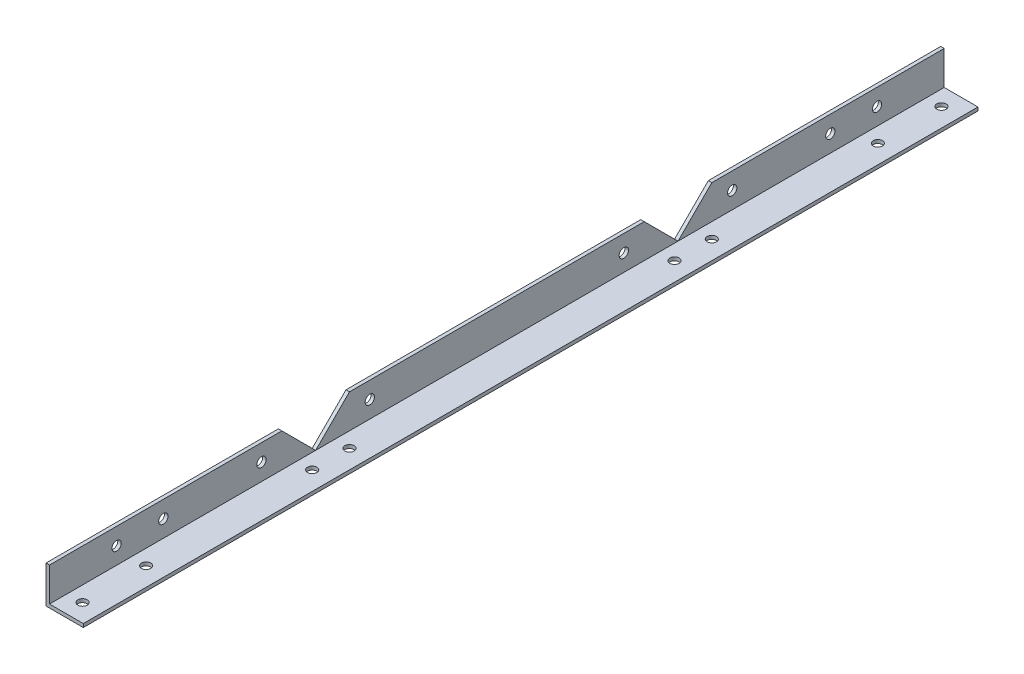
ISO-10303-21;
HEADER;
FILE_DESCRIPTION(('STEP AP214'),'2;1');
FILE_NAME('part.step','',(''),(''),'','','');
FILE_SCHEMA(('AUTOMOTIVE_DESIGN { 1 0 10303 214 1 1 1 1 }'));
ENDSEC;
DATA;
#1=APPLICATION_CONTEXT('core data for automotive mechanical design processes');
#2=APPLICATION_PROTOCOL_DEFINITION('international standard','automotive_design',2000,#1);
#3=PRODUCT_CONTEXT('',#1,'mechanical');
#4=PRODUCT('Part','Part','',(#3));
#5=PRODUCT_RELATED_PRODUCT_CATEGORY('part','',(#4));
#6=PRODUCT_DEFINITION_FORMATION('','',#4);
#7=PRODUCT_DEFINITION_CONTEXT('part definition',#1,'design');
#8=PRODUCT_DEFINITION('design','',#6,#7);
#9=PRODUCT_DEFINITION_SHAPE('','',#8);
#10=(LENGTH_UNIT() NAMED_UNIT(*) SI_UNIT(.MILLI.,.METRE.));
#11=(NAMED_UNIT(*) PLANE_ANGLE_UNIT() SI_UNIT($,.RADIAN.));
#12=(NAMED_UNIT(*) SI_UNIT($,.STERADIAN.) SOLID_ANGLE_UNIT());
#13=UNCERTAINTY_MEASURE_WITH_UNIT(LENGTH_MEASURE(1.E-05),#10,'distance_accuracy_value','');
#14=(GEOMETRIC_REPRESENTATION_CONTEXT(3) GLOBAL_UNCERTAINTY_ASSIGNED_CONTEXT((#13)) GLOBAL_UNIT_ASSIGNED_CONTEXT((#10,
#11,#12)) REPRESENTATION_CONTEXT('',''));
#15=CARTESIAN_POINT('',(0.,0.,0.));
#16=DIRECTION('',(0.,0.,1.));
#17=DIRECTION('',(1.,0.,0.));
#18=AXIS2_PLACEMENT_3D('',#15,#16,#17);
#19=CARTESIAN_POINT('',(0.,0.,208.28));
#20=DIRECTION('',(-1.,0.,0.));
#21=DIRECTION('',(0.,-1.,0.));
#22=AXIS2_PLACEMENT_3D('',#19,#20,#21);
#23=PLANE('',#22);
#24=CARTESIAN_POINT('',(0.,8.636,-194.31));
#25=DIRECTION('',(-1.,0.,0.));
#26=DIRECTION('',(0.,1.,0.));
#27=AXIS2_PLACEMENT_3D('',#24,#25,#26);
#28=CIRCLE('',#27,2.38125000000001);
#29=CARTESIAN_POINT('',(0.,11.01725,-194.31));
#30=VERTEX_POINT('',#29);
#31=EDGE_CURVE('E227',#30,#30,#28,.T.);
#32=ORIENTED_EDGE('',*,*,#31,.T.);
#33=EDGE_LOOP('',(#32));
#34=FACE_BOUND('',#33,.T.);
#35=CARTESIAN_POINT('',(0.,8.636,-170.434));
#36=DIRECTION('',(-1.,0.,0.));
#37=DIRECTION('',(0.,1.,0.));
#38=AXIS2_PLACEMENT_3D('',#35,#36,#37);
#39=CIRCLE('',#38,2.38125000000001);
#40=CARTESIAN_POINT('',(0.,11.01725,-170.434));
#41=VERTEX_POINT('',#40);
#42=EDGE_CURVE('E235',#41,#41,#39,.T.);
#43=ORIENTED_EDGE('',*,*,#42,.T.);
#44=EDGE_LOOP('',(#43));
#45=FACE_BOUND('',#44,.T.);
#46=CARTESIAN_POINT('',(0.,8.636,-120.269));
#47=DIRECTION('',(-1.,0.,0.));
#48=DIRECTION('',(0.,1.,0.));
#49=AXIS2_PLACEMENT_3D('',#46,#47,#48);
#50=CIRCLE('',#49,2.38125000000001);
#51=CARTESIAN_POINT('',(0.,11.01725,-120.269));
#52=VERTEX_POINT('',#51);
#53=EDGE_CURVE('E241',#52,#52,#50,.T.);
#54=ORIENTED_EDGE('',*,*,#53,.T.);
#55=EDGE_LOOP('',(#54));
#56=FACE_BOUND('',#55,.T.);
#57=DIRECTION('',(0.,-0.707106781186544,0.707106781186551));
#58=VECTOR('',#57,1.);
#59=CARTESIAN_POINT('',(0.,0.,-92.583));
#60=LINE('',#59,#58);
#61=CARTESIAN_POINT('',(0.,17.272,-109.855));
#62=VERTEX_POINT('',#61);
#63=CARTESIAN_POINT('',(0.,0.,-92.583));
#64=VERTEX_POINT('',#63);
#65=EDGE_CURVE('E256',#62,#64,#60,.T.);
#66=ORIENTED_EDGE('',*,*,#65,.T.);
#67=DIRECTION('',(0.,0.,-1.));
#68=VECTOR('',#67,1.);
#69=CARTESIAN_POINT('',(0.,0.,208.28));
#70=LINE('',#69,#68);
#71=CARTESIAN_POINT('',(0.,0.,-228.6));
#72=VERTEX_POINT('',#71);
#73=EDGE_CURVE('E101',#64,#72,#70,.T.);
#74=ORIENTED_EDGE('',*,*,#73,.T.);
#75=DIRECTION('',(0.,-1.,0.));
#76=VECTOR('',#75,1.);
#77=CARTESIAN_POINT('',(0.,17.272,-228.6));
#78=LINE('',#77,#76);
#79=CARTESIAN_POINT('',(0.,17.272,-228.6));
#80=VERTEX_POINT('',#79);
#81=EDGE_CURVE('E211',#80,#72,#78,.T.);
#82=ORIENTED_EDGE('',*,*,#81,.F.);
#83=DIRECTION('',(0.,0.,-1.));
#84=VECTOR('',#83,1.);
#85=CARTESIAN_POINT('',(0.,17.272,208.28));
#86=LINE('',#85,#84);
#87=EDGE_CURVE('E210',#62,#80,#86,.T.);
#88=ORIENTED_EDGE('',*,*,#87,.F.);
#89=EDGE_LOOP('',(#66,#74,#82,#88));
#90=FACE_BOUND('',#89,.T.);
#91=ADVANCED_FACE('F92',(#34,#45,#56,#90),#23,.F.);
#92=CARTESIAN_POINT('',(0.,8.636,-64.8969999999998));
#93=DIRECTION('',(-1.,0.,0.));
#94=DIRECTION('',(0.,1.,0.));
#95=AXIS2_PLACEMENT_3D('',#92,#93,#94);
#96=CIRCLE('',#95,2.38125000000001);
#97=CARTESIAN_POINT('',(0.,11.01725,-64.8969999999998));
#98=VERTEX_POINT('',#97);
#99=EDGE_CURVE('E226',#98,#98,#96,.T.);
#100=ORIENTED_EDGE('',*,*,#99,.T.);
#101=EDGE_LOOP('',(#100));
#102=FACE_BOUND('',#101,.T.);
#103=CARTESIAN_POINT('',(0.,8.636,64.8969999999998));
#104=DIRECTION('',(1.,0.,0.));
#105=DIRECTION('',(0.,1.,0.));
#106=AXIS2_PLACEMENT_3D('',#103,#104,#105);
#107=CIRCLE('',#106,2.38125000000001);
#108=CARTESIAN_POINT('',(0.,11.01725,64.8969999999998));
#109=VERTEX_POINT('',#108);
#110=EDGE_CURVE('E302',#109,#109,#107,.T.);
#111=ORIENTED_EDGE('',*,*,#110,.F.);
#112=EDGE_LOOP('',(#111));
#113=FACE_BOUND('',#112,.T.);
#114=DIRECTION('',(0.,0.707106781186544,0.707106781186551));
#115=VECTOR('',#114,1.);
#116=CARTESIAN_POINT('',(0.,17.272,-75.3109999999998));
#117=LINE('',#116,#115);
#118=CARTESIAN_POINT('',(0.,17.272,-75.3109999999998));
#119=VERTEX_POINT('',#118);
#120=EDGE_CURVE('E234',#64,#119,#117,.T.);
#121=ORIENTED_EDGE('',*,*,#120,.T.);
#122=CARTESIAN_POINT('',(0.,17.272,75.3109999999997));
#123=VERTEX_POINT('',#122);
#124=EDGE_CURVE('E351',#123,#119,#86,.T.);
#125=ORIENTED_EDGE('',*,*,#124,.F.);
#126=DIRECTION('',(0.,0.707106781186544,-0.707106781186551));
#127=VECTOR('',#126,1.);
#128=CARTESIAN_POINT('',(0.,17.272,75.3109999999997));
#129=LINE('',#128,#127);
#130=CARTESIAN_POINT('',(0.,0.,92.5829999999999));
#131=VERTEX_POINT('',#130);
#132=EDGE_CURVE('E314',#131,#123,#129,.T.);
#133=ORIENTED_EDGE('',*,*,#132,.F.);
#134=EDGE_CURVE('E100',#131,#64,#70,.T.);
#135=ORIENTED_EDGE('',*,*,#134,.T.);
#136=EDGE_LOOP('',(#121,#125,#133,#135));
#137=FACE_BOUND('',#136,.T.);
#138=ADVANCED_FACE('F363',(#102,#113,#137),#23,.F.);
#139=CARTESIAN_POINT('',(0.,17.272,208.28));
#140=DIRECTION('',(0.,-1.,0.));
#141=DIRECTION('',(0.,0.,-1.));
#142=AXIS2_PLACEMENT_3D('',#139,#140,#141);
#143=PLANE('',#142);
#144=DIRECTION('',(1.,0.,0.));
#145=VECTOR('',#144,1.);
#146=CARTESIAN_POINT('',(-40.3993661073767,17.272,-109.855));
#147=LINE('',#146,#145);
#148=CARTESIAN_POINT('',(-1.778,17.272,-109.855));
#149=VERTEX_POINT('',#148);
#150=EDGE_CURVE('E261',#149,#62,#147,.T.);
#151=ORIENTED_EDGE('',*,*,#150,.T.);
#152=ORIENTED_EDGE('',*,*,#87,.T.);
#153=DIRECTION('',(1.,0.,0.));
#154=VECTOR('',#153,1.);
#155=CARTESIAN_POINT('',(-1.778,17.272,-228.6));
#156=LINE('',#155,#154);
#157=CARTESIAN_POINT('',(-1.778,17.272,-228.6));
#158=VERTEX_POINT('',#157);
#159=EDGE_CURVE('E201',#158,#80,#156,.T.);
#160=ORIENTED_EDGE('',*,*,#159,.F.);
#161=DIRECTION('',(0.,0.,-1.));
#162=VECTOR('',#161,1.);
#163=CARTESIAN_POINT('',(-1.778,17.272,208.28));
#164=LINE('',#163,#162);
#165=EDGE_CURVE('E183',#149,#158,#164,.T.);
#166=ORIENTED_EDGE('',*,*,#165,.F.);
#167=EDGE_LOOP('',(#151,#152,#160,#166));
#168=FACE_BOUND('',#167,.T.);
#169=ADVANCED_FACE('F208',(#168),#143,.F.);
#170=DIRECTION('',(1.,0.,0.));
#171=VECTOR('',#170,1.);
#172=CARTESIAN_POINT('',(-40.3993661073767,17.272,-75.3109999999998));
#173=LINE('',#172,#171);
#174=CARTESIAN_POINT('',(-1.778,17.272,-75.3109999999998));
#175=VERTEX_POINT('',#174);
#176=EDGE_CURVE('E259',#175,#119,#173,.T.);
#177=ORIENTED_EDGE('',*,*,#176,.F.);
#178=CARTESIAN_POINT('',(-1.778,17.272,75.3109999999997));
#179=VERTEX_POINT('',#178);
#180=EDGE_CURVE('E193',#179,#175,#164,.T.);
#181=ORIENTED_EDGE('',*,*,#180,.F.);
#182=DIRECTION('',(1.,0.,0.));
#183=VECTOR('',#182,1.);
#184=CARTESIAN_POINT('',(-40.3993661073767,17.272,75.3109999999997));
#185=LINE('',#184,#183);
#186=EDGE_CURVE('E339',#179,#123,#185,.T.);
#187=ORIENTED_EDGE('',*,*,#186,.T.);
#188=ORIENTED_EDGE('',*,*,#124,.T.);
#189=EDGE_LOOP('',(#177,#181,#187,#188));
#190=FACE_BOUND('',#189,.T.);
#191=ADVANCED_FACE('F358',(#190),#143,.F.);
#192=CARTESIAN_POINT('',(-1.778,17.272,208.28));
#193=DIRECTION('',(1.,0.,0.));
#194=DIRECTION('',(0.,1.,0.));
#195=AXIS2_PLACEMENT_3D('',#192,#193,#194);
#196=PLANE('',#195);
#197=CARTESIAN_POINT('',(-1.778,8.636,-194.31));
#198=DIRECTION('',(1.,0.,0.));
#199=DIRECTION('',(0.,1.,0.));
#200=AXIS2_PLACEMENT_3D('',#197,#198,#199);
#201=CIRCLE('',#200,2.38125000000001);
#202=CARTESIAN_POINT('',(-1.778,11.01725,-194.31));
#203=VERTEX_POINT('',#202);
#204=EDGE_CURVE('E230',#203,#203,#201,.T.);
#205=ORIENTED_EDGE('',*,*,#204,.T.);
#206=EDGE_LOOP('',(#205));
#207=FACE_BOUND('',#206,.T.);
#208=CARTESIAN_POINT('',(-1.778,8.636,-170.434));
#209=DIRECTION('',(1.,0.,0.));
#210=DIRECTION('',(0.,1.,0.));
#211=AXIS2_PLACEMENT_3D('',#208,#209,#210);
#212=CIRCLE('',#211,2.38125000000001);
#213=CARTESIAN_POINT('',(-1.778,11.01725,-170.434));
#214=VERTEX_POINT('',#213);
#215=EDGE_CURVE('E231',#214,#214,#212,.T.);
#216=ORIENTED_EDGE('',*,*,#215,.T.);
#217=EDGE_LOOP('',(#216));
#218=FACE_BOUND('',#217,.T.);
#219=CARTESIAN_POINT('',(-1.778,8.636,-120.269));
#220=DIRECTION('',(1.,0.,0.));
#221=DIRECTION('',(0.,1.,0.));
#222=AXIS2_PLACEMENT_3D('',#219,#220,#221);
#223=CIRCLE('',#222,2.38125000000001);
#224=CARTESIAN_POINT('',(-1.778,11.01725,-120.269));
#225=VERTEX_POINT('',#224);
#226=EDGE_CURVE('E238',#225,#225,#223,.T.);
#227=ORIENTED_EDGE('',*,*,#226,.T.);
#228=EDGE_LOOP('',(#227));
#229=FACE_BOUND('',#228,.T.);
#230=CARTESIAN_POINT('',(-1.778,8.636,-64.8969999999998));
#231=DIRECTION('',(1.,0.,0.));
#232=DIRECTION('',(0.,1.,0.));
#233=AXIS2_PLACEMENT_3D('',#230,#231,#232);
#234=CIRCLE('',#233,2.38125000000001);
#235=CARTESIAN_POINT('',(-1.778,11.01725,-64.8969999999998));
#236=VERTEX_POINT('',#235);
#237=EDGE_CURVE('E244',#236,#236,#234,.T.);
#238=ORIENTED_EDGE('',*,*,#237,.T.);
#239=EDGE_LOOP('',(#238));
#240=FACE_BOUND('',#239,.T.);
#241=CARTESIAN_POINT('',(-1.778,8.636,64.8969999999998));
#242=DIRECTION('',(1.,0.,0.));
#243=DIRECTION('',(0.,1.,0.));
#244=AXIS2_PLACEMENT_3D('',#241,#242,#243);
#245=CIRCLE('',#244,2.38125000000001);
#246=CARTESIAN_POINT('',(-1.778,11.01725,64.8969999999998));
#247=VERTEX_POINT('',#246);
#248=EDGE_CURVE('E324',#247,#247,#245,.F.);
#249=ORIENTED_EDGE('',*,*,#248,.F.);
#250=EDGE_LOOP('',(#249));
#251=FACE_BOUND('',#250,.T.);
#252=CARTESIAN_POINT('',(-1.778,8.636,120.269));
#253=DIRECTION('',(1.,0.,0.));
#254=DIRECTION('',(0.,1.,0.));
#255=AXIS2_PLACEMENT_3D('',#252,#253,#254);
#256=CIRCLE('',#255,2.38125000000001);
#257=CARTESIAN_POINT('',(-1.778,11.01725,120.269));
#258=VERTEX_POINT('',#257);
#259=EDGE_CURVE('E318',#258,#258,#256,.F.);
#260=ORIENTED_EDGE('',*,*,#259,.F.);
#261=EDGE_LOOP('',(#260));
#262=FACE_BOUND('',#261,.T.);
#263=CARTESIAN_POINT('',(-1.778,8.636,170.434));
#264=DIRECTION('',(1.,0.,0.));
#265=DIRECTION('',(0.,1.,0.));
#266=AXIS2_PLACEMENT_3D('',#263,#264,#265);
#267=CIRCLE('',#266,2.38125000000001);
#268=CARTESIAN_POINT('',(-1.778,11.01725,170.434));
#269=VERTEX_POINT('',#268);
#270=EDGE_CURVE('E311',#269,#269,#267,.F.);
#271=ORIENTED_EDGE('',*,*,#270,.F.);
#272=EDGE_LOOP('',(#271));
#273=FACE_BOUND('',#272,.T.);
#274=CARTESIAN_POINT('',(-1.778,8.636,194.31));
#275=DIRECTION('',(1.,0.,0.));
#276=DIRECTION('',(0.,1.,0.));
#277=AXIS2_PLACEMENT_3D('',#274,#275,#276);
#278=CIRCLE('',#277,2.38125000000001);
#279=CARTESIAN_POINT('',(-1.778,11.01725,194.31));
#280=VERTEX_POINT('',#279);
#281=EDGE_CURVE('E310',#280,#280,#278,.F.);
#282=ORIENTED_EDGE('',*,*,#281,.F.);
#283=EDGE_LOOP('',(#282));
#284=FACE_BOUND('',#283,.T.);
#285=DIRECTION('',(0.,0.707106781186544,-0.707106781186551));
#286=VECTOR('',#285,1.);
#287=CARTESIAN_POINT('',(-1.778,0.,-92.583));
#288=LINE('',#287,#286);
#289=CARTESIAN_POINT('',(-1.778,0.,-92.5829999999999));
#290=VERTEX_POINT('',#289);
#291=EDGE_CURVE('E189',#290,#149,#288,.T.);
#292=ORIENTED_EDGE('',*,*,#291,.T.);
#293=ORIENTED_EDGE('',*,*,#165,.T.);
#294=DIRECTION('',(0.,1.,0.));
#295=VECTOR('',#294,1.);
#296=CARTESIAN_POINT('',(-1.778,-1.778,-228.6));
#297=LINE('',#296,#295);
#298=CARTESIAN_POINT('',(-1.778,-1.778,-228.6));
#299=VERTEX_POINT('',#298);
#300=EDGE_CURVE('E186',#299,#158,#297,.T.);
#301=ORIENTED_EDGE('',*,*,#300,.F.);
#302=DIRECTION('',(0.,0.,-1.));
#303=VECTOR('',#302,1.);
#304=CARTESIAN_POINT('',(-1.778,-1.778,208.28));
#305=LINE('',#304,#303);
#306=CARTESIAN_POINT('',(-1.778,-1.778,228.6));
#307=VERTEX_POINT('',#306);
#308=EDGE_CURVE('E194',#307,#299,#305,.T.);
#309=ORIENTED_EDGE('',*,*,#308,.F.);
#310=DIRECTION('',(0.,1.,0.));
#311=VECTOR('',#310,1.);
#312=CARTESIAN_POINT('',(-1.778,-1.778,228.6));
#313=LINE('',#312,#311);
#314=CARTESIAN_POINT('',(-1.778,17.272,228.6));
#315=VERTEX_POINT('',#314);
#316=EDGE_CURVE('E299',#307,#315,#313,.T.);
#317=ORIENTED_EDGE('',*,*,#316,.T.);
#318=CARTESIAN_POINT('',(-1.778,17.272,109.855));
#319=VERTEX_POINT('',#318);
#320=EDGE_CURVE('E196',#315,#319,#164,.T.);
#321=ORIENTED_EDGE('',*,*,#320,.T.);
#322=DIRECTION('',(0.,0.707106781186544,0.707106781186551));
#323=VECTOR('',#322,1.);
#324=CARTESIAN_POINT('',(-1.778,0.,92.5829999999999));
#325=LINE('',#324,#323);
#326=CARTESIAN_POINT('',(-1.778,0.,92.5829999999999));
#327=VERTEX_POINT('',#326);
#328=EDGE_CURVE('E331',#327,#319,#325,.T.);
#329=ORIENTED_EDGE('',*,*,#328,.F.);
#330=DIRECTION('',(0.,-0.707106781186544,0.707106781186551));
#331=VECTOR('',#330,1.);
#332=CARTESIAN_POINT('',(-1.778,17.272,75.3109999999997));
#333=LINE('',#332,#331);
#334=EDGE_CURVE('E333',#179,#327,#333,.T.);
#335=ORIENTED_EDGE('',*,*,#334,.F.);
#336=ORIENTED_EDGE('',*,*,#180,.T.);
#337=DIRECTION('',(0.,-0.707106781186544,-0.707106781186551));
#338=VECTOR('',#337,1.);
#339=CARTESIAN_POINT('',(-1.778,17.272,-75.3109999999998));
#340=LINE('',#339,#338);
#341=EDGE_CURVE('E251',#175,#290,#340,.T.);
#342=ORIENTED_EDGE('',*,*,#341,.T.);
#343=EDGE_LOOP('',(#292,#293,#301,#309,#317,#321,#329,#335,#336,#342));
#344=FACE_BOUND('',#343,.T.);
#345=ADVANCED_FACE('F185',(#207,#218,#229,#240,#251,#262,#273,#284,#344),#196,.F.);
#346=CARTESIAN_POINT('',(17.272,0.,208.28));
#347=DIRECTION('',(0.,-1.,0.));
#348=DIRECTION('',(1.,0.,0.));
#349=AXIS2_PLACEMENT_3D('',#346,#347,#348);
#350=PLANE('',#349);
#351=CARTESIAN_POINT('',(7.747,0.,-186.944));
#352=DIRECTION('',(0.,-1.,0.));
#353=DIRECTION('',(-1.,0.,0.));
#354=AXIS2_PLACEMENT_3D('',#351,#352,#353);
#355=CIRCLE('',#354,2.38125);
#356=CARTESIAN_POINT('',(5.36575,0.,-186.944));
#357=VERTEX_POINT('',#356);
#358=EDGE_CURVE('E536',#357,#357,#355,.T.);
#359=ORIENTED_EDGE('',*,*,#358,.T.);
#360=EDGE_LOOP('',(#359));
#361=FACE_BOUND('',#360,.T.);
#362=CARTESIAN_POINT('',(7.747,0.,-83.058));
#363=DIRECTION('',(0.,-1.,0.));
#364=DIRECTION('',(-1.,0.,0.));
#365=AXIS2_PLACEMENT_3D('',#362,#363,#364);
#366=CIRCLE('',#365,2.38125);
#367=CARTESIAN_POINT('',(5.36575,0.,-83.058));
#368=VERTEX_POINT('',#367);
#369=EDGE_CURVE('E529',#368,#368,#366,.T.);
#370=ORIENTED_EDGE('',*,*,#369,.T.);
#371=EDGE_LOOP('',(#370));
#372=FACE_BOUND('',#371,.T.);
#373=CARTESIAN_POINT('',(7.747,0.,-102.108));
#374=DIRECTION('',(0.,-1.,0.));
#375=DIRECTION('',(-1.,0.,0.));
#376=AXIS2_PLACEMENT_3D('',#373,#374,#375);
#377=CIRCLE('',#376,2.38125);
#378=CARTESIAN_POINT('',(5.36575,0.,-102.108));
#379=VERTEX_POINT('',#378);
#380=EDGE_CURVE('E533',#379,#379,#377,.T.);
#381=ORIENTED_EDGE('',*,*,#380,.T.);
#382=EDGE_LOOP('',(#381));
#383=FACE_BOUND('',#382,.T.);
#384=CARTESIAN_POINT('',(7.747,0.,-219.456));
#385=DIRECTION('',(0.,-1.,0.));
#386=DIRECTION('',(-1.,0.,0.));
#387=AXIS2_PLACEMENT_3D('',#384,#385,#386);
#388=CIRCLE('',#387,2.38125);
#389=CARTESIAN_POINT('',(5.36575,0.,-219.456));
#390=VERTEX_POINT('',#389);
#391=EDGE_CURVE('E216',#390,#390,#388,.T.);
#392=ORIENTED_EDGE('',*,*,#391,.T.);
#393=EDGE_LOOP('',(#392));
#394=FACE_BOUND('',#393,.T.);
#395=CARTESIAN_POINT('',(7.747,0.,186.944));
#396=DIRECTION('',(0.,1.,0.));
#397=DIRECTION('',(-1.,0.,0.));
#398=AXIS2_PLACEMENT_3D('',#395,#396,#397);
#399=CIRCLE('',#398,2.38125);
#400=CARTESIAN_POINT('',(5.36575,0.,186.944));
#401=VERTEX_POINT('',#400);
#402=EDGE_CURVE('E253',#401,#401,#399,.T.);
#403=ORIENTED_EDGE('',*,*,#402,.F.);
#404=EDGE_LOOP('',(#403));
#405=FACE_BOUND('',#404,.T.);
#406=CARTESIAN_POINT('',(7.747,0.,83.0579999999999));
#407=DIRECTION('',(0.,1.,0.));
#408=DIRECTION('',(-1.,0.,0.));
#409=AXIS2_PLACEMENT_3D('',#406,#407,#408);
#410=CIRCLE('',#409,2.38125);
#411=CARTESIAN_POINT('',(5.36575,0.,83.0579999999999));
#412=VERTEX_POINT('',#411);
#413=EDGE_CURVE('E265',#412,#412,#410,.T.);
#414=ORIENTED_EDGE('',*,*,#413,.F.);
#415=EDGE_LOOP('',(#414));
#416=FACE_BOUND('',#415,.T.);
#417=CARTESIAN_POINT('',(7.747,0.,102.108));
#418=DIRECTION('',(0.,1.,0.));
#419=DIRECTION('',(-1.,0.,0.));
#420=AXIS2_PLACEMENT_3D('',#417,#418,#419);
#421=CIRCLE('',#420,2.38125);
#422=CARTESIAN_POINT('',(5.36575,0.,102.108));
#423=VERTEX_POINT('',#422);
#424=EDGE_CURVE('E272',#423,#423,#421,.T.);
#425=ORIENTED_EDGE('',*,*,#424,.F.);
#426=EDGE_LOOP('',(#425));
#427=FACE_BOUND('',#426,.T.);
#428=CARTESIAN_POINT('',(7.747,0.,219.456));
#429=DIRECTION('',(0.,1.,0.));
#430=DIRECTION('',(-1.,0.,0.));
#431=AXIS2_PLACEMENT_3D('',#428,#429,#430);
#432=CIRCLE('',#431,2.38125);
#433=CARTESIAN_POINT('',(5.36575,0.,219.456));
#434=VERTEX_POINT('',#433);
#435=EDGE_CURVE('E282',#434,#434,#432,.T.);
#436=ORIENTED_EDGE('',*,*,#435,.F.);
#437=EDGE_LOOP('',(#436));
#438=FACE_BOUND('',#437,.T.);
#439=DIRECTION('',(0.,0.,-1.));
#440=VECTOR('',#439,1.);
#441=CARTESIAN_POINT('',(17.272,0.,208.28));
#442=LINE('',#441,#440);
#443=CARTESIAN_POINT('',(17.272,0.,228.6));
#444=VERTEX_POINT('',#443);
#445=CARTESIAN_POINT('',(17.272,0.,-228.6));
#446=VERTEX_POINT('',#445);
#447=EDGE_CURVE('E335',#444,#446,#442,.T.);
#448=ORIENTED_EDGE('',*,*,#447,.T.);
#449=DIRECTION('',(1.,0.,0.));
#450=VECTOR('',#449,1.);
#451=CARTESIAN_POINT('',(-1.778,0.,-228.6));
#452=LINE('',#451,#450);
#453=EDGE_CURVE('E206',#72,#446,#452,.T.);
#454=ORIENTED_EDGE('',*,*,#453,.F.);
#455=ORIENTED_EDGE('',*,*,#73,.F.);
#456=ORIENTED_EDGE('',*,*,#134,.F.);
#457=CARTESIAN_POINT('',(0.,0.,228.6));
#458=VERTEX_POINT('',#457);
#459=EDGE_CURVE('E14',#458,#131,#70,.T.);
#460=ORIENTED_EDGE('',*,*,#459,.F.);
#461=DIRECTION('',(1.,0.,0.));
#462=VECTOR('',#461,1.);
#463=CARTESIAN_POINT('',(-1.778,0.,228.6));
#464=LINE('',#463,#462);
#465=EDGE_CURVE('E289',#458,#444,#464,.T.);
#466=ORIENTED_EDGE('',*,*,#465,.T.);
#467=EDGE_LOOP('',(#448,#454,#455,#456,#460,#466));
#468=FACE_BOUND('',#467,.T.);
#469=ADVANCED_FACE('F94',(#361,#372,#383,#394,#405,#416,#427,#438,#468),#350,.F.);
#470=CARTESIAN_POINT('',(0.,8.636,194.31));
#471=DIRECTION('',(1.,0.,0.));
#472=DIRECTION('',(0.,1.,0.));
#473=AXIS2_PLACEMENT_3D('',#470,#471,#472);
#474=CIRCLE('',#473,2.38125000000001);
#475=CARTESIAN_POINT('',(0.,11.01725,194.31));
#476=VERTEX_POINT('',#475);
#477=EDGE_CURVE('E307',#476,#476,#474,.T.);
#478=ORIENTED_EDGE('',*,*,#477,.F.);
#479=EDGE_LOOP('',(#478));
#480=FACE_BOUND('',#479,.T.);
#481=CARTESIAN_POINT('',(0.,8.636,170.434));
#482=DIRECTION('',(1.,0.,0.));
#483=DIRECTION('',(0.,1.,0.));
#484=AXIS2_PLACEMENT_3D('',#481,#482,#483);
#485=CIRCLE('',#484,2.38125000000001);
#486=CARTESIAN_POINT('',(0.,11.01725,170.434));
#487=VERTEX_POINT('',#486);
#488=EDGE_CURVE('E315',#487,#487,#485,.T.);
#489=ORIENTED_EDGE('',*,*,#488,.F.);
#490=EDGE_LOOP('',(#489));
#491=FACE_BOUND('',#490,.T.);
#492=CARTESIAN_POINT('',(0.,8.636,120.269));
#493=DIRECTION('',(1.,0.,0.));
#494=DIRECTION('',(0.,1.,0.));
#495=AXIS2_PLACEMENT_3D('',#492,#493,#494);
#496=CIRCLE('',#495,2.38125000000001);
#497=CARTESIAN_POINT('',(0.,11.01725,120.269));
#498=VERTEX_POINT('',#497);
#499=EDGE_CURVE('E321',#498,#498,#496,.T.);
#500=ORIENTED_EDGE('',*,*,#499,.F.);
#501=EDGE_LOOP('',(#500));
#502=FACE_BOUND('',#501,.T.);
#503=ORIENTED_EDGE('',*,*,#459,.T.);
#504=DIRECTION('',(0.,-0.707106781186544,-0.707106781186551));
#505=VECTOR('',#504,1.);
#506=CARTESIAN_POINT('',(0.,0.,92.5829999999999));
#507=LINE('',#506,#505);
#508=CARTESIAN_POINT('',(0.,17.272,109.855));
#509=VERTEX_POINT('',#508);
#510=EDGE_CURVE('E337',#509,#131,#507,.T.);
#511=ORIENTED_EDGE('',*,*,#510,.F.);
#512=CARTESIAN_POINT('',(0.,17.272,228.6));
#513=VERTEX_POINT('',#512);
#514=EDGE_CURVE('E349',#513,#509,#86,.T.);
#515=ORIENTED_EDGE('',*,*,#514,.F.);
#516=DIRECTION('',(0.,-1.,0.));
#517=VECTOR('',#516,1.);
#518=CARTESIAN_POINT('',(0.,17.272,228.6));
#519=LINE('',#518,#517);
#520=EDGE_CURVE('E288',#513,#458,#519,.T.);
#521=ORIENTED_EDGE('',*,*,#520,.T.);
#522=EDGE_LOOP('',(#503,#511,#515,#521));
#523=FACE_BOUND('',#522,.T.);
#524=ADVANCED_FACE('F389',(#480,#491,#502,#523),#23,.F.);
#525=ORIENTED_EDGE('',*,*,#514,.T.);
#526=DIRECTION('',(1.,0.,0.));
#527=VECTOR('',#526,1.);
#528=CARTESIAN_POINT('',(-40.3993661073767,17.272,109.855));
#529=LINE('',#528,#527);
#530=EDGE_CURVE('E341',#319,#509,#529,.T.);
#531=ORIENTED_EDGE('',*,*,#530,.F.);
#532=ORIENTED_EDGE('',*,*,#320,.F.);
#533=DIRECTION('',(1.,0.,0.));
#534=VECTOR('',#533,1.);
#535=CARTESIAN_POINT('',(-1.778,17.272,228.6));
#536=LINE('',#535,#534);
#537=EDGE_CURVE('E293',#315,#513,#536,.T.);
#538=ORIENTED_EDGE('',*,*,#537,.T.);
#539=EDGE_LOOP('',(#525,#531,#532,#538));
#540=FACE_BOUND('',#539,.T.);
#541=ADVANCED_FACE('F385',(#540),#143,.F.);
#542=CARTESIAN_POINT('',(-1.778,-1.778,208.28));
#543=DIRECTION('',(0.,1.,0.));
#544=DIRECTION('',(-1.,0.,0.));
#545=AXIS2_PLACEMENT_3D('',#542,#543,#544);
#546=PLANE('',#545);
#547=CARTESIAN_POINT('',(7.747,-1.778,-186.944));
#548=DIRECTION('',(0.,1.,0.));
#549=DIRECTION('',(-1.,0.,0.));
#550=AXIS2_PLACEMENT_3D('',#547,#548,#549);
#551=CIRCLE('',#550,2.38125);
#552=CARTESIAN_POINT('',(5.36575,-1.778,-186.944));
#553=VERTEX_POINT('',#552);
#554=EDGE_CURVE('E531',#553,#553,#551,.T.);
#555=ORIENTED_EDGE('',*,*,#554,.T.);
#556=EDGE_LOOP('',(#555));
#557=FACE_BOUND('',#556,.T.);
#558=CARTESIAN_POINT('',(7.747,-1.778,-83.058));
#559=DIRECTION('',(0.,1.,0.));
#560=DIRECTION('',(-1.,0.,0.));
#561=AXIS2_PLACEMENT_3D('',#558,#559,#560);
#562=CIRCLE('',#561,2.38125);
#563=CARTESIAN_POINT('',(5.36575,-1.778,-83.058));
#564=VERTEX_POINT('',#563);
#565=EDGE_CURVE('E526',#564,#564,#562,.T.);
#566=ORIENTED_EDGE('',*,*,#565,.T.);
#567=EDGE_LOOP('',(#566));
#568=FACE_BOUND('',#567,.T.);
#569=CARTESIAN_POINT('',(7.747,-1.778,-102.108));
#570=DIRECTION('',(0.,1.,0.));
#571=DIRECTION('',(-1.,0.,0.));
#572=AXIS2_PLACEMENT_3D('',#569,#570,#571);
#573=CIRCLE('',#572,2.38125);
#574=CARTESIAN_POINT('',(5.36575,-1.778,-102.108));
#575=VERTEX_POINT('',#574);
#576=EDGE_CURVE('E543',#575,#575,#573,.T.);
#577=ORIENTED_EDGE('',*,*,#576,.T.);
#578=EDGE_LOOP('',(#577));
#579=FACE_BOUND('',#578,.T.);
#580=CARTESIAN_POINT('',(7.747,-1.778,-219.456));
#581=DIRECTION('',(0.,1.,0.));
#582=DIRECTION('',(-1.,0.,0.));
#583=AXIS2_PLACEMENT_3D('',#580,#581,#582);
#584=CIRCLE('',#583,2.38125);
#585=CARTESIAN_POINT('',(5.36575,-1.778,-219.456));
#586=VERTEX_POINT('',#585);
#587=EDGE_CURVE('E212',#586,#586,#584,.T.);
#588=ORIENTED_EDGE('',*,*,#587,.T.);
#589=EDGE_LOOP('',(#588));
#590=FACE_BOUND('',#589,.T.);
#591=CARTESIAN_POINT('',(7.747,-1.778,186.944));
#592=DIRECTION('',(0.,1.,0.));
#593=DIRECTION('',(-1.,0.,0.));
#594=AXIS2_PLACEMENT_3D('',#591,#592,#593);
#595=CIRCLE('',#594,2.38125);
#596=CARTESIAN_POINT('',(5.36575,-1.778,186.944));
#597=VERTEX_POINT('',#596);
#598=EDGE_CURVE('E269',#597,#597,#595,.F.);
#599=ORIENTED_EDGE('',*,*,#598,.F.);
#600=EDGE_LOOP('',(#599));
#601=FACE_BOUND('',#600,.T.);
#602=CARTESIAN_POINT('',(7.747,-1.778,83.0579999999999));
#603=DIRECTION('',(0.,1.,0.));
#604=DIRECTION('',(-1.,0.,0.));
#605=AXIS2_PLACEMENT_3D('',#602,#603,#604);
#606=CIRCLE('',#605,2.38125);
#607=CARTESIAN_POINT('',(5.36575,-1.778,83.0579999999999));
#608=VERTEX_POINT('',#607);
#609=EDGE_CURVE('E268',#608,#608,#606,.F.);
#610=ORIENTED_EDGE('',*,*,#609,.F.);
#611=EDGE_LOOP('',(#610));
#612=FACE_BOUND('',#611,.T.);
#613=CARTESIAN_POINT('',(7.747,-1.778,102.108));
#614=DIRECTION('',(0.,1.,0.));
#615=DIRECTION('',(-1.,0.,0.));
#616=AXIS2_PLACEMENT_3D('',#613,#614,#615);
#617=CIRCLE('',#616,2.38125);
#618=CARTESIAN_POINT('',(5.36575,-1.778,102.108));
#619=VERTEX_POINT('',#618);
#620=EDGE_CURVE('E279',#619,#619,#617,.F.);
#621=ORIENTED_EDGE('',*,*,#620,.F.);
#622=EDGE_LOOP('',(#621));
#623=FACE_BOUND('',#622,.T.);
#624=CARTESIAN_POINT('',(7.747,-1.778,219.456));
#625=DIRECTION('',(0.,1.,0.));
#626=DIRECTION('',(-1.,0.,0.));
#627=AXIS2_PLACEMENT_3D('',#624,#625,#626);
#628=CIRCLE('',#627,2.38125);
#629=CARTESIAN_POINT('',(5.36575,-1.778,219.456));
#630=VERTEX_POINT('',#629);
#631=EDGE_CURVE('E285',#630,#630,#628,.F.);
#632=ORIENTED_EDGE('',*,*,#631,.F.);
#633=EDGE_LOOP('',(#632));
#634=FACE_BOUND('',#633,.T.);
#635=ORIENTED_EDGE('',*,*,#308,.T.);
#636=DIRECTION('',(1.,0.,0.));
#637=VECTOR('',#636,1.);
#638=CARTESIAN_POINT('',(-1.778,-1.778,-228.6));
#639=LINE('',#638,#637);
#640=CARTESIAN_POINT('',(17.272,-1.778,-228.6));
#641=VERTEX_POINT('',#640);
#642=EDGE_CURVE('E205',#299,#641,#639,.T.);
#643=ORIENTED_EDGE('',*,*,#642,.T.);
#644=DIRECTION('',(0.,0.,-1.));
#645=VECTOR('',#644,1.);
#646=CARTESIAN_POINT('',(17.272,-1.778,208.28));
#647=LINE('',#646,#645);
#648=CARTESIAN_POINT('',(17.272,-1.778,228.6));
#649=VERTEX_POINT('',#648);
#650=EDGE_CURVE('E346',#649,#641,#647,.T.);
#651=ORIENTED_EDGE('',*,*,#650,.F.);
#652=DIRECTION('',(1.,0.,0.));
#653=VECTOR('',#652,1.);
#654=CARTESIAN_POINT('',(-1.778,-1.778,228.6));
#655=LINE('',#654,#653);
#656=EDGE_CURVE('E296',#307,#649,#655,.T.);
#657=ORIENTED_EDGE('',*,*,#656,.F.);
#658=EDGE_LOOP('',(#635,#643,#651,#657));
#659=FACE_BOUND('',#658,.T.);
#660=ADVANCED_FACE('F377',(#557,#568,#579,#590,#601,#612,#623,#634,#659),#546,.F.);
#661=CARTESIAN_POINT('',(17.272,-1.778,208.28));
#662=DIRECTION('',(-1.,0.,0.));
#663=DIRECTION('',(0.,0.,1.));
#664=AXIS2_PLACEMENT_3D('',#661,#662,#663);
#665=PLANE('',#664);
#666=ORIENTED_EDGE('',*,*,#650,.T.);
#667=DIRECTION('',(0.,1.,0.));
#668=VECTOR('',#667,1.);
#669=CARTESIAN_POINT('',(17.272,-1.778,-228.6));
#670=LINE('',#669,#668);
#671=EDGE_CURVE('E223',#641,#446,#670,.T.);
#672=ORIENTED_EDGE('',*,*,#671,.T.);
#673=ORIENTED_EDGE('',*,*,#447,.F.);
#674=DIRECTION('',(0.,1.,0.));
#675=VECTOR('',#674,1.);
#676=CARTESIAN_POINT('',(17.272,-1.778,228.6));
#677=LINE('',#676,#675);
#678=EDGE_CURVE('E292',#649,#444,#677,.T.);
#679=ORIENTED_EDGE('',*,*,#678,.F.);
#680=EDGE_LOOP('',(#666,#672,#673,#679));
#681=FACE_BOUND('',#680,.T.);
#682=ADVANCED_FACE('F373',(#681),#665,.F.);
#683=CARTESIAN_POINT('',(-40.3993661073767,17.272,75.3109999999997));
#684=DIRECTION('',(0.,-0.707106781186551,-0.707106781186544));
#685=DIRECTION('',(0.,0.707106781186544,-0.707106781186551));
#686=AXIS2_PLACEMENT_3D('',#683,#684,#685);
#687=PLANE('',#686);
#688=ORIENTED_EDGE('',*,*,#334,.T.);
#689=DIRECTION('',(1.,0.,0.));
#690=VECTOR('',#689,1.);
#691=CARTESIAN_POINT('',(-40.3993661073767,0.,92.5829999999999));
#692=LINE('',#691,#690);
#693=EDGE_CURVE('E116',#327,#131,#692,.T.);
#694=ORIENTED_EDGE('',*,*,#693,.T.);
#695=ORIENTED_EDGE('',*,*,#132,.T.);
#696=ORIENTED_EDGE('',*,*,#186,.F.);
#697=EDGE_LOOP('',(#688,#694,#695,#696));
#698=FACE_BOUND('',#697,.T.);
#699=ADVANCED_FACE('F423',(#698),#687,.F.);
#700=CARTESIAN_POINT('',(-40.3993661073767,0.,92.5829999999999));
#701=DIRECTION('',(0.,-0.707106781186551,0.707106781186544));
#702=DIRECTION('',(0.,-0.707106781186544,-0.707106781186551));
#703=AXIS2_PLACEMENT_3D('',#700,#701,#702);
#704=PLANE('',#703);
#705=ORIENTED_EDGE('',*,*,#328,.T.);
#706=ORIENTED_EDGE('',*,*,#530,.T.);
#707=ORIENTED_EDGE('',*,*,#510,.T.);
#708=ORIENTED_EDGE('',*,*,#693,.F.);
#709=EDGE_LOOP('',(#705,#706,#707,#708));
#710=FACE_BOUND('',#709,.T.);
#711=ADVANCED_FACE('F387',(#710),#704,.F.);
#712=CARTESIAN_POINT('',(-40.3993661073767,8.636,64.8969999999998));
#713=DIRECTION('',(1.,0.,0.));
#714=DIRECTION('',(0.,1.,0.));
#715=AXIS2_PLACEMENT_3D('',#712,#713,#714);
#716=CYLINDRICAL_SURFACE('',#715,2.38125000000001);
#717=ORIENTED_EDGE('',*,*,#248,.T.);
#718=EDGE_LOOP('',(#717));
#719=FACE_BOUND('',#718,.T.);
#720=ORIENTED_EDGE('',*,*,#110,.T.);
#721=EDGE_LOOP('',(#720));
#722=FACE_BOUND('',#721,.T.);
#723=ADVANCED_FACE('F411',(#719,#722),#716,.F.);
#724=CARTESIAN_POINT('',(-40.3993661073767,8.636,120.269));
#725=DIRECTION('',(1.,0.,0.));
#726=DIRECTION('',(0.,1.,0.));
#727=AXIS2_PLACEMENT_3D('',#724,#725,#726);
#728=CYLINDRICAL_SURFACE('',#727,2.38125000000001);
#729=ORIENTED_EDGE('',*,*,#259,.T.);
#730=EDGE_LOOP('',(#729));
#731=FACE_BOUND('',#730,.T.);
#732=ORIENTED_EDGE('',*,*,#499,.T.);
#733=EDGE_LOOP('',(#732));
#734=FACE_BOUND('',#733,.T.);
#735=ADVANCED_FACE('F413',(#731,#734),#728,.F.);
#736=CARTESIAN_POINT('',(-40.3993661073767,8.636,170.434));
#737=DIRECTION('',(1.,0.,0.));
#738=DIRECTION('',(0.,1.,0.));
#739=AXIS2_PLACEMENT_3D('',#736,#737,#738);
#740=CYLINDRICAL_SURFACE('',#739,2.38125000000001);
#741=ORIENTED_EDGE('',*,*,#270,.T.);
#742=EDGE_LOOP('',(#741));
#743=FACE_BOUND('',#742,.T.);
#744=ORIENTED_EDGE('',*,*,#488,.T.);
#745=EDGE_LOOP('',(#744));
#746=FACE_BOUND('',#745,.T.);
#747=ADVANCED_FACE('F420',(#743,#746),#740,.F.);
#748=CARTESIAN_POINT('',(-40.3993661073767,8.636,194.31));
#749=DIRECTION('',(1.,0.,0.));
#750=DIRECTION('',(0.,1.,0.));
#751=AXIS2_PLACEMENT_3D('',#748,#749,#750);
#752=CYLINDRICAL_SURFACE('',#751,2.38125000000001);
#753=ORIENTED_EDGE('',*,*,#281,.T.);
#754=EDGE_LOOP('',(#753));
#755=FACE_BOUND('',#754,.T.);
#756=ORIENTED_EDGE('',*,*,#477,.T.);
#757=EDGE_LOOP('',(#756));
#758=FACE_BOUND('',#757,.T.);
#759=ADVANCED_FACE('F456',(#755,#758),#752,.F.);
#760=CARTESIAN_POINT('',(0.,0.,228.6));
#761=DIRECTION('',(0.,0.,1.));
#762=DIRECTION('',(1.,0.,0.));
#763=AXIS2_PLACEMENT_3D('',#760,#761,#762);
#764=PLANE('',#763);
#765=ORIENTED_EDGE('',*,*,#465,.F.);
#766=ORIENTED_EDGE('',*,*,#520,.F.);
#767=ORIENTED_EDGE('',*,*,#537,.F.);
#768=ORIENTED_EDGE('',*,*,#316,.F.);
#769=ORIENTED_EDGE('',*,*,#656,.T.);
#770=ORIENTED_EDGE('',*,*,#678,.T.);
#771=EDGE_LOOP('',(#765,#766,#767,#768,#769,#770));
#772=FACE_BOUND('',#771,.T.);
#773=ADVANCED_FACE('F384',(#772),#764,.T.);
#774=CARTESIAN_POINT('',(7.747,-8.51319209080187,219.456));
#775=DIRECTION('',(0.,1.,0.));
#776=DIRECTION('',(-1.,0.,0.));
#777=AXIS2_PLACEMENT_3D('',#774,#775,#776);
#778=CYLINDRICAL_SURFACE('',#777,2.38125);
#779=ORIENTED_EDGE('',*,*,#631,.T.);
#780=EDGE_LOOP('',(#779));
#781=FACE_BOUND('',#780,.T.);
#782=ORIENTED_EDGE('',*,*,#435,.T.);
#783=EDGE_LOOP('',(#782));
#784=FACE_BOUND('',#783,.T.);
#785=ADVANCED_FACE('F464',(#781,#784),#778,.F.);
#786=CARTESIAN_POINT('',(7.747,-8.51319209080187,102.108));
#787=DIRECTION('',(0.,1.,0.));
#788=DIRECTION('',(-1.,0.,0.));
#789=AXIS2_PLACEMENT_3D('',#786,#787,#788);
#790=CYLINDRICAL_SURFACE('',#789,2.38125);
#791=ORIENTED_EDGE('',*,*,#620,.T.);
#792=EDGE_LOOP('',(#791));
#793=FACE_BOUND('',#792,.T.);
#794=ORIENTED_EDGE('',*,*,#424,.T.);
#795=EDGE_LOOP('',(#794));
#796=FACE_BOUND('',#795,.T.);
#797=ADVANCED_FACE('F470',(#793,#796),#790,.F.);
#798=CARTESIAN_POINT('',(7.747,-8.51319209080187,83.0579999999999));
#799=DIRECTION('',(0.,1.,0.));
#800=DIRECTION('',(-1.,0.,0.));
#801=AXIS2_PLACEMENT_3D('',#798,#799,#800);
#802=CYLINDRICAL_SURFACE('',#801,2.38125);
#803=ORIENTED_EDGE('',*,*,#609,.T.);
#804=EDGE_LOOP('',(#803));
#805=FACE_BOUND('',#804,.T.);
#806=ORIENTED_EDGE('',*,*,#413,.T.);
#807=EDGE_LOOP('',(#806));
#808=FACE_BOUND('',#807,.T.);
#809=ADVANCED_FACE('F474',(#805,#808),#802,.F.);
#810=CARTESIAN_POINT('',(7.747,-8.51319209080187,186.944));
#811=DIRECTION('',(0.,1.,0.));
#812=DIRECTION('',(-1.,0.,0.));
#813=AXIS2_PLACEMENT_3D('',#810,#811,#812);
#814=CYLINDRICAL_SURFACE('',#813,2.38125);
#815=ORIENTED_EDGE('',*,*,#598,.T.);
#816=EDGE_LOOP('',(#815));
#817=FACE_BOUND('',#816,.T.);
#818=ORIENTED_EDGE('',*,*,#402,.T.);
#819=EDGE_LOOP('',(#818));
#820=FACE_BOUND('',#819,.T.);
#821=ADVANCED_FACE('F476',(#817,#820),#814,.F.);
#822=CARTESIAN_POINT('',(-40.3993661073767,0.,-92.583));
#823=DIRECTION('',(0.,0.707106781186551,0.707106781186544));
#824=DIRECTION('',(0.,-0.707106781186544,0.707106781186551));
#825=AXIS2_PLACEMENT_3D('',#822,#823,#824);
#826=PLANE('',#825);
#827=DIRECTION('',(1.,0.,0.));
#828=VECTOR('',#827,1.);
#829=CARTESIAN_POINT('',(-40.3993661073767,0.,-92.583));
#830=LINE('',#829,#828);
#831=EDGE_CURVE('E108',#290,#64,#830,.T.);
#832=ORIENTED_EDGE('',*,*,#831,.T.);
#833=ORIENTED_EDGE('',*,*,#65,.F.);
#834=ORIENTED_EDGE('',*,*,#150,.F.);
#835=ORIENTED_EDGE('',*,*,#291,.F.);
#836=EDGE_LOOP('',(#832,#833,#834,#835));
#837=FACE_BOUND('',#836,.T.);
#838=ADVANCED_FACE('F479',(#837),#826,.T.);
#839=CARTESIAN_POINT('',(-40.3993661073767,17.272,-75.3109999999998));
#840=DIRECTION('',(0.,0.707106781186551,-0.707106781186544));
#841=DIRECTION('',(0.,0.707106781186544,0.707106781186551));
#842=AXIS2_PLACEMENT_3D('',#839,#840,#841);
#843=PLANE('',#842);
#844=ORIENTED_EDGE('',*,*,#176,.T.);
#845=ORIENTED_EDGE('',*,*,#120,.F.);
#846=ORIENTED_EDGE('',*,*,#831,.F.);
#847=ORIENTED_EDGE('',*,*,#341,.F.);
#848=EDGE_LOOP('',(#844,#845,#846,#847));
#849=FACE_BOUND('',#848,.T.);
#850=ADVANCED_FACE('F366',(#849),#843,.T.);
#851=CARTESIAN_POINT('',(-40.3993661073767,8.636,-64.8969999999998));
#852=DIRECTION('',(1.,0.,0.));
#853=DIRECTION('',(0.,1.,0.));
#854=AXIS2_PLACEMENT_3D('',#851,#852,#853);
#855=CYLINDRICAL_SURFACE('',#854,2.38125000000001);
#856=ORIENTED_EDGE('',*,*,#237,.F.);
#857=EDGE_LOOP('',(#856));
#858=FACE_BOUND('',#857,.T.);
#859=ORIENTED_EDGE('',*,*,#99,.F.);
#860=EDGE_LOOP('',(#859));
#861=FACE_BOUND('',#860,.T.);
#862=ADVANCED_FACE('F486',(#858,#861),#855,.F.);
#863=CARTESIAN_POINT('',(-40.3993661073767,8.636,-120.269));
#864=DIRECTION('',(1.,0.,0.));
#865=DIRECTION('',(0.,1.,0.));
#866=AXIS2_PLACEMENT_3D('',#863,#864,#865);
#867=CYLINDRICAL_SURFACE('',#866,2.38125000000001);
#868=ORIENTED_EDGE('',*,*,#226,.F.);
#869=EDGE_LOOP('',(#868));
#870=FACE_BOUND('',#869,.T.);
#871=ORIENTED_EDGE('',*,*,#53,.F.);
#872=EDGE_LOOP('',(#871));
#873=FACE_BOUND('',#872,.T.);
#874=ADVANCED_FACE('F491',(#870,#873),#867,.F.);
#875=CARTESIAN_POINT('',(-40.3993661073767,8.636,-170.434));
#876=DIRECTION('',(1.,0.,0.));
#877=DIRECTION('',(0.,1.,0.));
#878=AXIS2_PLACEMENT_3D('',#875,#876,#877);
#879=CYLINDRICAL_SURFACE('',#878,2.38125000000001);
#880=ORIENTED_EDGE('',*,*,#215,.F.);
#881=EDGE_LOOP('',(#880));
#882=FACE_BOUND('',#881,.T.);
#883=ORIENTED_EDGE('',*,*,#42,.F.);
#884=EDGE_LOOP('',(#883));
#885=FACE_BOUND('',#884,.T.);
#886=ADVANCED_FACE('F495',(#882,#885),#879,.F.);
#887=CARTESIAN_POINT('',(-40.3993661073767,8.636,-194.31));
#888=DIRECTION('',(1.,0.,0.));
#889=DIRECTION('',(0.,1.,0.));
#890=AXIS2_PLACEMENT_3D('',#887,#888,#889);
#891=CYLINDRICAL_SURFACE('',#890,2.38125000000001);
#892=ORIENTED_EDGE('',*,*,#204,.F.);
#893=EDGE_LOOP('',(#892));
#894=FACE_BOUND('',#893,.T.);
#895=ORIENTED_EDGE('',*,*,#31,.F.);
#896=EDGE_LOOP('',(#895));
#897=FACE_BOUND('',#896,.T.);
#898=ADVANCED_FACE('F499',(#894,#897),#891,.F.);
#899=CARTESIAN_POINT('',(0.,0.,-228.6));
#900=DIRECTION('',(0.,0.,-1.));
#901=DIRECTION('',(1.,0.,0.));
#902=AXIS2_PLACEMENT_3D('',#899,#900,#901);
#903=PLANE('',#902);
#904=ORIENTED_EDGE('',*,*,#300,.T.);
#905=ORIENTED_EDGE('',*,*,#159,.T.);
#906=ORIENTED_EDGE('',*,*,#81,.T.);
#907=ORIENTED_EDGE('',*,*,#453,.T.);
#908=ORIENTED_EDGE('',*,*,#671,.F.);
#909=ORIENTED_EDGE('',*,*,#642,.F.);
#910=EDGE_LOOP('',(#904,#905,#906,#907,#908,#909));
#911=FACE_BOUND('',#910,.T.);
#912=ADVANCED_FACE('F199',(#911),#903,.T.);
#913=CARTESIAN_POINT('',(7.747,-8.51319209080187,-219.456));
#914=DIRECTION('',(0.,1.,0.));
#915=DIRECTION('',(-1.,0.,0.));
#916=AXIS2_PLACEMENT_3D('',#913,#914,#915);
#917=CYLINDRICAL_SURFACE('',#916,2.38125);
#918=ORIENTED_EDGE('',*,*,#587,.F.);
#919=EDGE_LOOP('',(#918));
#920=FACE_BOUND('',#919,.T.);
#921=ORIENTED_EDGE('',*,*,#391,.F.);
#922=EDGE_LOOP('',(#921));
#923=FACE_BOUND('',#922,.T.);
#924=ADVANCED_FACE('F506',(#920,#923),#917,.F.);
#925=CARTESIAN_POINT('',(7.747,-8.51319209080187,-102.108));
#926=DIRECTION('',(0.,1.,0.));
#927=DIRECTION('',(-1.,0.,0.));
#928=AXIS2_PLACEMENT_3D('',#925,#926,#927);
#929=CYLINDRICAL_SURFACE('',#928,2.38125);
#930=ORIENTED_EDGE('',*,*,#576,.F.);
#931=EDGE_LOOP('',(#930));
#932=FACE_BOUND('',#931,.T.);
#933=ORIENTED_EDGE('',*,*,#380,.F.);
#934=EDGE_LOOP('',(#933));
#935=FACE_BOUND('',#934,.T.);
#936=ADVANCED_FACE('F509',(#932,#935),#929,.F.);
#937=CARTESIAN_POINT('',(7.747,-8.51319209080187,-83.058));
#938=DIRECTION('',(0.,1.,0.));
#939=DIRECTION('',(-1.,0.,0.));
#940=AXIS2_PLACEMENT_3D('',#937,#938,#939);
#941=CYLINDRICAL_SURFACE('',#940,2.38125);
#942=ORIENTED_EDGE('',*,*,#565,.F.);
#943=EDGE_LOOP('',(#942));
#944=FACE_BOUND('',#943,.T.);
#945=ORIENTED_EDGE('',*,*,#369,.F.);
#946=EDGE_LOOP('',(#945));
#947=FACE_BOUND('',#946,.T.);
#948=ADVANCED_FACE('F513',(#944,#947),#941,.F.);
#949=CARTESIAN_POINT('',(7.747,-8.51319209080187,-186.944));
#950=DIRECTION('',(0.,1.,0.));
#951=DIRECTION('',(-1.,0.,0.));
#952=AXIS2_PLACEMENT_3D('',#949,#950,#951);
#953=CYLINDRICAL_SURFACE('',#952,2.38125);
#954=ORIENTED_EDGE('',*,*,#554,.F.);
#955=EDGE_LOOP('',(#954));
#956=FACE_BOUND('',#955,.T.);
#957=ORIENTED_EDGE('',*,*,#358,.F.);
#958=EDGE_LOOP('',(#957));
#959=FACE_BOUND('',#958,.T.);
#960=ADVANCED_FACE('F515',(#956,#959),#953,.F.);
#961=CLOSED_SHELL('',(#91,#138,#169,#191,#345,#469,#524,#541,#660,#682,#699,#711,#723,#735,#747,
#759,#773,#785,#797,#809,#821,#838,#850,#862,#874,#886,#898,#912,#924,#936,#948,#960));
#962=MANIFOLD_SOLID_BREP('B2',#961);
#963=ADVANCED_BREP_SHAPE_REPRESENTATION('',(#18,#962),#14);
#964=SHAPE_DEFINITION_REPRESENTATION(#9,#963);
ENDSEC;
END-ISO-10303-21;
